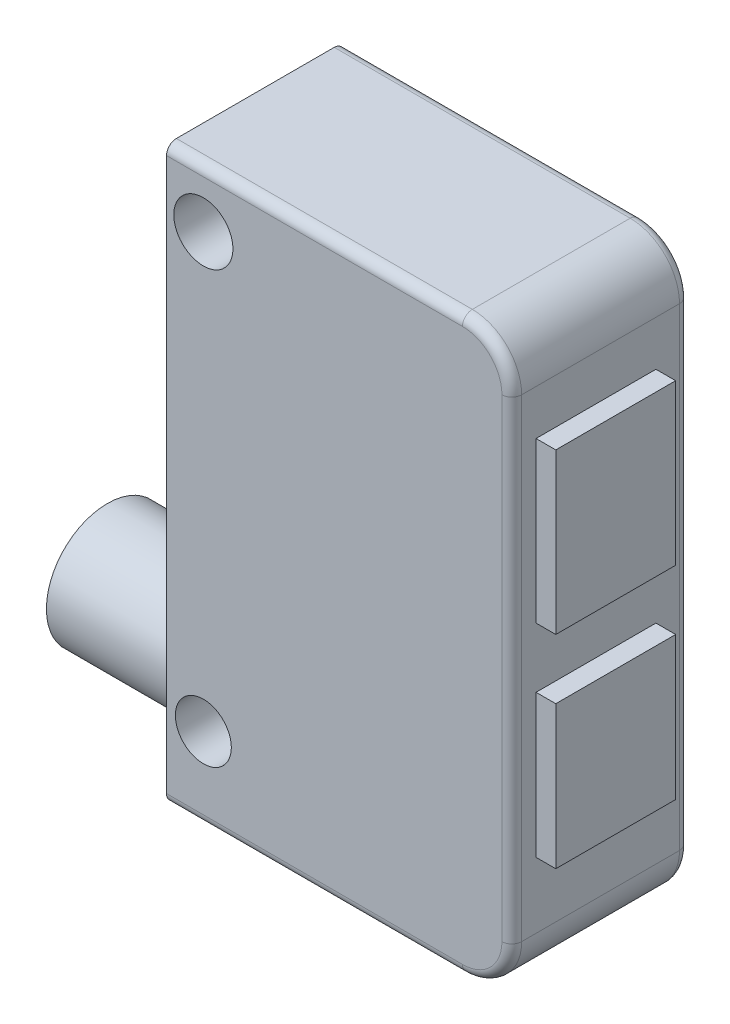
ISO-10303-21;
HEADER;
FILE_DESCRIPTION(('STEP AP214'),'2;1');
FILE_NAME('part.step','',(''),(''),'','','');
FILE_SCHEMA(('AUTOMOTIVE_DESIGN { 1 0 10303 214 1 1 1 1 }'));
ENDSEC;
DATA;
#1=APPLICATION_CONTEXT('core data for automotive mechanical design processes');
#2=APPLICATION_PROTOCOL_DEFINITION('international standard','automotive_design',2000,#1);
#3=PRODUCT_CONTEXT('',#1,'mechanical');
#4=PRODUCT('Part','Part','',(#3));
#5=PRODUCT_RELATED_PRODUCT_CATEGORY('part','',(#4));
#6=PRODUCT_DEFINITION_FORMATION('','',#4);
#7=PRODUCT_DEFINITION_CONTEXT('part definition',#1,'design');
#8=PRODUCT_DEFINITION('design','',#6,#7);
#9=PRODUCT_DEFINITION_SHAPE('','',#8);
#10=(LENGTH_UNIT() NAMED_UNIT(*) SI_UNIT(.MILLI.,.METRE.));
#11=(NAMED_UNIT(*) PLANE_ANGLE_UNIT() SI_UNIT($,.RADIAN.));
#12=(NAMED_UNIT(*) SI_UNIT($,.STERADIAN.) SOLID_ANGLE_UNIT());
#13=UNCERTAINTY_MEASURE_WITH_UNIT(LENGTH_MEASURE(1.E-05),#10,'distance_accuracy_value','');
#14=(GEOMETRIC_REPRESENTATION_CONTEXT(3) GLOBAL_UNCERTAINTY_ASSIGNED_CONTEXT((#13)) GLOBAL_UNIT_ASSIGNED_CONTEXT((#10,
#11,#12)) REPRESENTATION_CONTEXT('',''));
#15=CARTESIAN_POINT('',(0.,0.,0.));
#16=DIRECTION('',(0.,0.,1.));
#17=DIRECTION('',(1.,0.,0.));
#18=AXIS2_PLACEMENT_3D('',#15,#16,#17);
#19=CARTESIAN_POINT('',(17.5,29.,18.));
#20=DIRECTION('',(-1.,0.,0.));
#21=DIRECTION('',(0.,-1.,0.));
#22=AXIS2_PLACEMENT_3D('',#19,#20,#21);
#23=PLANE('',#22);
#24=DIRECTION('',(0.,1.,0.));
#25=VECTOR('',#24,1.);
#26=CARTESIAN_POINT('',(17.5,3.23268340968709,3.39148902415762));
#27=LINE('',#26,#25);
#28=CARTESIAN_POINT('',(17.5,3.23268340968709,3.39148902415762));
#29=VERTEX_POINT('',#28);
#30=CARTESIAN_POINT('',(17.5,19.4350484510095,3.39148902415762));
#31=VERTEX_POINT('',#30);
#32=EDGE_CURVE('E194',#29,#31,#27,.T.);
#33=ORIENTED_EDGE('',*,*,#32,.F.);
#34=DIRECTION('',(0.,0.,-1.));
#35=VECTOR('',#34,1.);
#36=CARTESIAN_POINT('',(17.5,3.23268340968709,15.5432628051494));
#37=LINE('',#36,#35);
#38=CARTESIAN_POINT('',(17.5,3.23268340968709,15.5432628051494));
#39=VERTEX_POINT('',#38);
#40=EDGE_CURVE('E207',#39,#29,#37,.T.);
#41=ORIENTED_EDGE('',*,*,#40,.F.);
#42=DIRECTION('',(0.,-1.,0.));
#43=VECTOR('',#42,1.);
#44=CARTESIAN_POINT('',(17.5,3.23268340968709,15.5432628051494));
#45=LINE('',#44,#43);
#46=CARTESIAN_POINT('',(17.5,19.4350484510095,15.5432628051494));
#47=VERTEX_POINT('',#46);
#48=EDGE_CURVE('E216',#47,#39,#45,.T.);
#49=ORIENTED_EDGE('',*,*,#48,.F.);
#50=DIRECTION('',(0.,0.,1.));
#51=VECTOR('',#50,1.);
#52=CARTESIAN_POINT('',(17.5,19.4350484510095,15.5432628051494));
#53=LINE('',#52,#51);
#54=EDGE_CURVE('E197',#31,#47,#53,.T.);
#55=ORIENTED_EDGE('',*,*,#54,.F.);
#56=EDGE_LOOP('',(#33,#41,#49,#55));
#57=FACE_BOUND('',#56,.T.);
#58=DIRECTION('',(0.,0.,-1.));
#59=VECTOR('',#58,1.);
#60=CARTESIAN_POINT('',(17.5,-24.,18.));
#61=LINE('',#60,#59);
#62=CARTESIAN_POINT('',(17.5,-24.,17.));
#63=VERTEX_POINT('',#62);
#64=CARTESIAN_POINT('',(17.5,-24.,1.));
#65=VERTEX_POINT('',#64);
#66=EDGE_CURVE('E267',#63,#65,#61,.T.);
#67=ORIENTED_EDGE('',*,*,#66,.T.);
#68=DIRECTION('',(0.,1.,0.));
#69=VECTOR('',#68,1.);
#70=CARTESIAN_POINT('',(17.5,29.,1.));
#71=LINE('',#70,#69);
#72=CARTESIAN_POINT('',(17.5,24.,1.));
#73=VERTEX_POINT('',#72);
#74=EDGE_CURVE('E305',#65,#73,#71,.T.);
#75=ORIENTED_EDGE('',*,*,#74,.T.);
#76=DIRECTION('',(0.,0.,-1.));
#77=VECTOR('',#76,1.);
#78=CARTESIAN_POINT('',(17.5,24.,18.));
#79=LINE('',#78,#77);
#80=CARTESIAN_POINT('',(17.5,24.,17.));
#81=VERTEX_POINT('',#80);
#82=EDGE_CURVE('E264',#73,#81,#79,.F.);
#83=ORIENTED_EDGE('',*,*,#82,.T.);
#84=DIRECTION('',(0.,1.,0.));
#85=VECTOR('',#84,1.);
#86=CARTESIAN_POINT('',(17.5,-24.,17.));
#87=LINE('',#86,#85);
#88=EDGE_CURVE('E303',#81,#63,#87,.F.);
#89=ORIENTED_EDGE('',*,*,#88,.T.);
#90=EDGE_LOOP('',(#67,#75,#83,#89));
#91=FACE_BOUND('',#90,.T.);
#92=DIRECTION('',(0.,1.,0.));
#93=VECTOR('',#92,1.);
#94=CARTESIAN_POINT('',(17.5,-17.3318568350683,3.39148902415762));
#95=LINE('',#94,#93);
#96=CARTESIAN_POINT('',(17.5,-17.3318568350683,3.39148902415762));
#97=VERTEX_POINT('',#96);
#98=CARTESIAN_POINT('',(17.5,-2.84320348080882,3.39148902415762));
#99=VERTEX_POINT('',#98);
#100=EDGE_CURVE('E193',#97,#99,#95,.T.);
#101=ORIENTED_EDGE('',*,*,#100,.F.);
#102=DIRECTION('',(0.,0.,-1.));
#103=VECTOR('',#102,1.);
#104=CARTESIAN_POINT('',(17.5,-17.3318568350683,15.5432628051494));
#105=LINE('',#104,#103);
#106=CARTESIAN_POINT('',(17.5,-17.3318568350683,15.5432628051494));
#107=VERTEX_POINT('',#106);
#108=EDGE_CURVE('E190',#107,#97,#105,.T.);
#109=ORIENTED_EDGE('',*,*,#108,.F.);
#110=DIRECTION('',(0.,-1.,0.));
#111=VECTOR('',#110,1.);
#112=CARTESIAN_POINT('',(17.5,-17.3318568350683,15.5432628051494));
#113=LINE('',#112,#111);
#114=CARTESIAN_POINT('',(17.5,-2.84320348080882,15.5432628051494));
#115=VERTEX_POINT('',#114);
#116=EDGE_CURVE('E57',#115,#107,#113,.T.);
#117=ORIENTED_EDGE('',*,*,#116,.F.);
#118=DIRECTION('',(0.,0.,1.));
#119=VECTOR('',#118,1.);
#120=CARTESIAN_POINT('',(17.5,-2.84320348080882,15.5432628051494));
#121=LINE('',#120,#119);
#122=EDGE_CURVE('E52',#99,#115,#121,.T.);
#123=ORIENTED_EDGE('',*,*,#122,.F.);
#124=EDGE_LOOP('',(#101,#109,#117,#123));
#125=FACE_BOUND('',#124,.T.);
#126=ADVANCED_FACE('F35',(#57,#91,#125),#23,.F.);
#127=CARTESIAN_POINT('',(-17.5,29.,18.));
#128=DIRECTION('',(0.,-1.,0.));
#129=DIRECTION('',(0.,0.,-1.));
#130=AXIS2_PLACEMENT_3D('',#127,#128,#129);
#131=PLANE('',#130);
#132=DIRECTION('',(0.,0.,-1.));
#133=VECTOR('',#132,1.);
#134=CARTESIAN_POINT('',(12.5,29.,18.));
#135=LINE('',#134,#133);
#136=CARTESIAN_POINT('',(12.5,29.,17.));
#137=VERTEX_POINT('',#136);
#138=CARTESIAN_POINT('',(12.5,29.,1.));
#139=VERTEX_POINT('',#138);
#140=EDGE_CURVE('E273',#137,#139,#135,.T.);
#141=ORIENTED_EDGE('',*,*,#140,.T.);
#142=DIRECTION('',(-1.,0.,0.));
#143=VECTOR('',#142,1.);
#144=CARTESIAN_POINT('',(-17.5,29.,1.));
#145=LINE('',#144,#143);
#146=CARTESIAN_POINT('',(-17.5,29.,1.));
#147=VERTEX_POINT('',#146);
#148=EDGE_CURVE('E11',#139,#147,#145,.T.);
#149=ORIENTED_EDGE('',*,*,#148,.T.);
#150=DIRECTION('',(0.,0.,-1.));
#151=VECTOR('',#150,1.);
#152=CARTESIAN_POINT('',(-17.5,29.,18.));
#153=LINE('',#152,#151);
#154=CARTESIAN_POINT('',(-17.5,29.,17.));
#155=VERTEX_POINT('',#154);
#156=EDGE_CURVE('E258',#155,#147,#153,.T.);
#157=ORIENTED_EDGE('',*,*,#156,.F.);
#158=DIRECTION('',(-1.,0.,0.));
#159=VECTOR('',#158,1.);
#160=CARTESIAN_POINT('',(12.5,29.,17.));
#161=LINE('',#160,#159);
#162=EDGE_CURVE('E44',#155,#137,#161,.F.);
#163=ORIENTED_EDGE('',*,*,#162,.T.);
#164=EDGE_LOOP('',(#141,#149,#157,#163));
#165=FACE_BOUND('',#164,.T.);
#166=ADVANCED_FACE('F405',(#165),#131,.F.);
#167=CARTESIAN_POINT('',(-17.5,29.,18.));
#168=DIRECTION('',(1.,0.,0.));
#169=DIRECTION('',(0.,1.,0.));
#170=AXIS2_PLACEMENT_3D('',#167,#168,#169);
#171=PLANE('',#170);
#172=CARTESIAN_POINT('',(-17.5,-21.7144106468702,8.));
#173=DIRECTION('',(1.,0.,0.));
#174=DIRECTION('',(0.,1.,0.));
#175=AXIS2_PLACEMENT_3D('',#172,#173,#174);
#176=CIRCLE('',#175,6.1718519708485);
#177=CARTESIAN_POINT('',(-17.5,-15.5425586760217,8.));
#178=VERTEX_POINT('',#177);
#179=EDGE_CURVE('E261',#178,#178,#176,.F.);
#180=ORIENTED_EDGE('',*,*,#179,.F.);
#181=EDGE_LOOP('',(#180));
#182=FACE_BOUND('',#181,.T.);
#183=DIRECTION('',(0.,-1.,0.));
#184=VECTOR('',#183,1.);
#185=CARTESIAN_POINT('',(-17.5,29.,0.));
#186=LINE('',#185,#184);
#187=CARTESIAN_POINT('',(-17.5,28.,0.));
#188=VERTEX_POINT('',#187);
#189=CARTESIAN_POINT('',(-17.5,-28.,0.));
#190=VERTEX_POINT('',#189);
#191=EDGE_CURVE('E248',#188,#190,#186,.T.);
#192=ORIENTED_EDGE('',*,*,#191,.T.);
#193=CARTESIAN_POINT('',(-17.5,-28.,1.));
#194=DIRECTION('',(1.,0.,0.));
#195=DIRECTION('',(0.,1.,0.));
#196=AXIS2_PLACEMENT_3D('',#193,#194,#195);
#197=CIRCLE('',#196,1.);
#198=CARTESIAN_POINT('',(-17.5,-29.,1.));
#199=VERTEX_POINT('',#198);
#200=EDGE_CURVE('E297',#190,#199,#197,.F.);
#201=ORIENTED_EDGE('',*,*,#200,.T.);
#202=DIRECTION('',(0.,0.,-1.));
#203=VECTOR('',#202,1.);
#204=CARTESIAN_POINT('',(-17.5,-29.,18.));
#205=LINE('',#204,#203);
#206=CARTESIAN_POINT('',(-17.5,-29.,17.));
#207=VERTEX_POINT('',#206);
#208=EDGE_CURVE('E253',#207,#199,#205,.T.);
#209=ORIENTED_EDGE('',*,*,#208,.F.);
#210=CARTESIAN_POINT('',(-17.5,-28.,17.));
#211=DIRECTION('',(1.,0.,0.));
#212=DIRECTION('',(0.,1.,0.));
#213=AXIS2_PLACEMENT_3D('',#210,#211,#212);
#214=CIRCLE('',#213,1.);
#215=CARTESIAN_POINT('',(-17.5,-28.,18.));
#216=VERTEX_POINT('',#215);
#217=EDGE_CURVE('E295',#207,#216,#214,.F.);
#218=ORIENTED_EDGE('',*,*,#217,.T.);
#219=DIRECTION('',(0.,-1.,0.));
#220=VECTOR('',#219,1.);
#221=CARTESIAN_POINT('',(-17.5,29.,18.));
#222=LINE('',#221,#220);
#223=CARTESIAN_POINT('',(-17.5,28.,18.));
#224=VERTEX_POINT('',#223);
#225=EDGE_CURVE('E250',#224,#216,#222,.T.);
#226=ORIENTED_EDGE('',*,*,#225,.F.);
#227=CARTESIAN_POINT('',(-17.5,28.,17.));
#228=DIRECTION('',(1.,0.,0.));
#229=DIRECTION('',(0.,1.,0.));
#230=AXIS2_PLACEMENT_3D('',#227,#228,#229);
#231=CIRCLE('',#230,1.);
#232=EDGE_CURVE('E291',#224,#155,#231,.F.);
#233=ORIENTED_EDGE('',*,*,#232,.T.);
#234=ORIENTED_EDGE('',*,*,#156,.T.);
#235=CARTESIAN_POINT('',(-17.5,28.,1.));
#236=DIRECTION('',(1.,0.,0.));
#237=DIRECTION('',(0.,1.,0.));
#238=AXIS2_PLACEMENT_3D('',#235,#236,#237);
#239=CIRCLE('',#238,1.);
#240=EDGE_CURVE('E293',#147,#188,#239,.F.);
#241=ORIENTED_EDGE('',*,*,#240,.T.);
#242=EDGE_LOOP('',(#192,#201,#209,#218,#226,#233,#234,#241));
#243=FACE_BOUND('',#242,.T.);
#244=ADVANCED_FACE('F357',(#182,#243),#171,.F.);
#245=CARTESIAN_POINT('',(-17.5,-29.,18.));
#246=DIRECTION('',(0.,1.,0.));
#247=DIRECTION('',(0.,0.,1.));
#248=AXIS2_PLACEMENT_3D('',#245,#246,#247);
#249=PLANE('',#248);
#250=ORIENTED_EDGE('',*,*,#208,.T.);
#251=DIRECTION('',(1.,0.,0.));
#252=VECTOR('',#251,1.);
#253=CARTESIAN_POINT('',(-17.5,-29.,1.));
#254=LINE('',#253,#252);
#255=CARTESIAN_POINT('',(12.5,-29.,1.));
#256=VERTEX_POINT('',#255);
#257=EDGE_CURVE('E278',#199,#256,#254,.T.);
#258=ORIENTED_EDGE('',*,*,#257,.T.);
#259=DIRECTION('',(0.,0.,-1.));
#260=VECTOR('',#259,1.);
#261=CARTESIAN_POINT('',(12.5,-29.,18.));
#262=LINE('',#261,#260);
#263=CARTESIAN_POINT('',(12.5,-29.,17.));
#264=VERTEX_POINT('',#263);
#265=EDGE_CURVE('E270',#256,#264,#262,.F.);
#266=ORIENTED_EDGE('',*,*,#265,.T.);
#267=DIRECTION('',(1.,0.,0.));
#268=VECTOR('',#267,1.);
#269=CARTESIAN_POINT('',(-17.5,-29.,17.));
#270=LINE('',#269,#268);
#271=EDGE_CURVE('E276',#264,#207,#270,.F.);
#272=ORIENTED_EDGE('',*,*,#271,.T.);
#273=EDGE_LOOP('',(#250,#258,#266,#272));
#274=FACE_BOUND('',#273,.T.);
#275=ADVANCED_FACE('F376',(#274),#249,.F.);
#276=CARTESIAN_POINT('',(0.,0.,18.));
#277=DIRECTION('',(0.,0.,1.));
#278=DIRECTION('',(1.,0.,0.));
#279=AXIS2_PLACEMENT_3D('',#276,#277,#278);
#280=PLANE('',#279);
#281=CARTESIAN_POINT('',(-13.7643029473936,-20.6813842234187,18.));
#282=DIRECTION('',(0.,0.,1.));
#283=DIRECTION('',(1.,0.,0.));
#284=AXIS2_PLACEMENT_3D('',#281,#282,#283);
#285=CIRCLE('',#284,2.83545668190059);
#286=CARTESIAN_POINT('',(-10.928846265493,-20.6813842234187,18.));
#287=VERTEX_POINT('',#286);
#288=EDGE_CURVE('E232',#287,#287,#285,.T.);
#289=ORIENTED_EDGE('',*,*,#288,.F.);
#290=EDGE_LOOP('',(#289));
#291=FACE_BOUND('',#290,.T.);
#292=CARTESIAN_POINT('',(-13.7643029473936,23.1740557682377,18.));
#293=DIRECTION('',(0.,0.,1.));
#294=DIRECTION('',(1.,0.,0.));
#295=AXIS2_PLACEMENT_3D('',#292,#293,#294);
#296=CIRCLE('',#295,2.99773064042235);
#297=CARTESIAN_POINT('',(-10.7665723069712,23.1740557682377,18.));
#298=VERTEX_POINT('',#297);
#299=EDGE_CURVE('E236',#298,#298,#296,.T.);
#300=ORIENTED_EDGE('',*,*,#299,.F.);
#301=EDGE_LOOP('',(#300));
#302=FACE_BOUND('',#301,.T.);
#303=ORIENTED_EDGE('',*,*,#225,.T.);
#304=DIRECTION('',(1.,0.,0.));
#305=VECTOR('',#304,1.);
#306=CARTESIAN_POINT('',(12.5,-28.,18.));
#307=LINE('',#306,#305);
#308=CARTESIAN_POINT('',(12.5,-28.,18.));
#309=VERTEX_POINT('',#308);
#310=EDGE_CURVE('E319',#216,#309,#307,.T.);
#311=ORIENTED_EDGE('',*,*,#310,.T.);
#312=CARTESIAN_POINT('',(12.5,-24.,18.));
#313=DIRECTION('',(0.,0.,1.));
#314=DIRECTION('',(1.,0.,0.));
#315=AXIS2_PLACEMENT_3D('',#312,#313,#314);
#316=CIRCLE('',#315,4.);
#317=CARTESIAN_POINT('',(16.5,-24.,18.));
#318=VERTEX_POINT('',#317);
#319=EDGE_CURVE('E317',#309,#318,#316,.T.);
#320=ORIENTED_EDGE('',*,*,#319,.T.);
#321=DIRECTION('',(0.,1.,0.));
#322=VECTOR('',#321,1.);
#323=CARTESIAN_POINT('',(16.5,24.,18.));
#324=LINE('',#323,#322);
#325=CARTESIAN_POINT('',(16.5,24.,18.));
#326=VERTEX_POINT('',#325);
#327=EDGE_CURVE('E315',#318,#326,#324,.T.);
#328=ORIENTED_EDGE('',*,*,#327,.T.);
#329=CARTESIAN_POINT('',(12.5,24.,18.));
#330=DIRECTION('',(0.,0.,1.));
#331=DIRECTION('',(1.,0.,0.));
#332=AXIS2_PLACEMENT_3D('',#329,#330,#331);
#333=CIRCLE('',#332,4.);
#334=CARTESIAN_POINT('',(12.5,28.,18.));
#335=VERTEX_POINT('',#334);
#336=EDGE_CURVE('E313',#326,#335,#333,.T.);
#337=ORIENTED_EDGE('',*,*,#336,.T.);
#338=DIRECTION('',(-1.,0.,0.));
#339=VECTOR('',#338,1.);
#340=CARTESIAN_POINT('',(-17.5,28.,18.));
#341=LINE('',#340,#339);
#342=EDGE_CURVE('E311',#335,#224,#341,.T.);
#343=ORIENTED_EDGE('',*,*,#342,.T.);
#344=EDGE_LOOP('',(#303,#311,#320,#328,#337,#343));
#345=FACE_BOUND('',#344,.T.);
#346=ADVANCED_FACE('F354',(#291,#302,#345),#280,.T.);
#347=CARTESIAN_POINT('',(0.,0.,0.));
#348=DIRECTION('',(0.,0.,1.));
#349=DIRECTION('',(1.,0.,0.));
#350=AXIS2_PLACEMENT_3D('',#347,#348,#349);
#351=PLANE('',#350);
#352=CARTESIAN_POINT('',(12.5,-24.,0.));
#353=DIRECTION('',(0.,0.,1.));
#354=DIRECTION('',(1.,0.,0.));
#355=AXIS2_PLACEMENT_3D('',#352,#353,#354);
#356=CIRCLE('',#355,4.);
#357=CARTESIAN_POINT('',(16.5,-24.,0.));
#358=VERTEX_POINT('',#357);
#359=CARTESIAN_POINT('',(12.5,-28.,0.));
#360=VERTEX_POINT('',#359);
#361=EDGE_CURVE('E287',#358,#360,#356,.F.);
#362=ORIENTED_EDGE('',*,*,#361,.T.);
#363=DIRECTION('',(1.,0.,0.));
#364=VECTOR('',#363,1.);
#365=CARTESIAN_POINT('',(0.,-28.,0.));
#366=LINE('',#365,#364);
#367=EDGE_CURVE('E289',#360,#190,#366,.F.);
#368=ORIENTED_EDGE('',*,*,#367,.T.);
#369=ORIENTED_EDGE('',*,*,#191,.F.);
#370=DIRECTION('',(-1.,0.,0.));
#371=VECTOR('',#370,1.);
#372=CARTESIAN_POINT('',(0.,28.,0.));
#373=LINE('',#372,#371);
#374=CARTESIAN_POINT('',(12.5,28.,0.));
#375=VERTEX_POINT('',#374);
#376=EDGE_CURVE('E281',#188,#375,#373,.F.);
#377=ORIENTED_EDGE('',*,*,#376,.T.);
#378=CARTESIAN_POINT('',(12.5,24.,0.));
#379=DIRECTION('',(0.,0.,1.));
#380=DIRECTION('',(1.,0.,0.));
#381=AXIS2_PLACEMENT_3D('',#378,#379,#380);
#382=CIRCLE('',#381,4.);
#383=CARTESIAN_POINT('',(16.5,24.,0.));
#384=VERTEX_POINT('',#383);
#385=EDGE_CURVE('E283',#375,#384,#382,.F.);
#386=ORIENTED_EDGE('',*,*,#385,.T.);
#387=DIRECTION('',(0.,1.,0.));
#388=VECTOR('',#387,1.);
#389=CARTESIAN_POINT('',(16.5,0.,0.));
#390=LINE('',#389,#388);
#391=EDGE_CURVE('E285',#384,#358,#390,.F.);
#392=ORIENTED_EDGE('',*,*,#391,.T.);
#393=EDGE_LOOP('',(#362,#368,#369,#377,#386,#392));
#394=FACE_BOUND('',#393,.T.);
#395=ADVANCED_FACE('F412',(#394),#351,.F.);
#396=CARTESIAN_POINT('',(-33.5,-21.7144106468702,8.));
#397=DIRECTION('',(1.,0.,0.));
#398=DIRECTION('',(0.,1.,0.));
#399=AXIS2_PLACEMENT_3D('',#396,#397,#398);
#400=CYLINDRICAL_SURFACE('',#399,6.1718519708485);
#401=CARTESIAN_POINT('',(-33.5,-21.7144106468702,8.));
#402=DIRECTION('',(-1.,0.,0.));
#403=DIRECTION('',(0.,-1.,0.));
#404=AXIS2_PLACEMENT_3D('',#401,#402,#403);
#405=CIRCLE('',#404,6.1718519708485);
#406=CARTESIAN_POINT('',(-33.5,-27.8862626177187,8.));
#407=VERTEX_POINT('',#406);
#408=EDGE_CURVE('E245',#407,#407,#405,.T.);
#409=ORIENTED_EDGE('',*,*,#408,.F.);
#410=EDGE_LOOP('',(#409));
#411=FACE_BOUND('',#410,.T.);
#412=ORIENTED_EDGE('',*,*,#179,.T.);
#413=EDGE_LOOP('',(#412));
#414=FACE_BOUND('',#413,.T.);
#415=ADVANCED_FACE('F414',(#411,#414),#400,.T.);
#416=CARTESIAN_POINT('',(-33.5,-21.7144106468702,8.));
#417=DIRECTION('',(-1.,0.,0.));
#418=DIRECTION('',(0.,-1.,0.));
#419=AXIS2_PLACEMENT_3D('',#416,#417,#418);
#420=PLANE('',#419);
#421=ORIENTED_EDGE('',*,*,#408,.T.);
#422=EDGE_LOOP('',(#421));
#423=FACE_BOUND('',#422,.T.);
#424=ADVANCED_FACE('F420',(#423),#420,.T.);
#425=CARTESIAN_POINT('',(12.5,-24.,18.));
#426=DIRECTION('',(0.,0.,-1.));
#427=DIRECTION('',(-1.,0.,0.));
#428=AXIS2_PLACEMENT_3D('',#425,#426,#427);
#429=CYLINDRICAL_SURFACE('',#428,5.);
#430=ORIENTED_EDGE('',*,*,#265,.F.);
#431=CARTESIAN_POINT('',(12.5,-24.,1.));
#432=DIRECTION('',(0.,0.,1.));
#433=DIRECTION('',(1.,0.,0.));
#434=AXIS2_PLACEMENT_3D('',#431,#432,#433);
#435=CIRCLE('',#434,5.);
#436=EDGE_CURVE('E301',#256,#65,#435,.T.);
#437=ORIENTED_EDGE('',*,*,#436,.T.);
#438=ORIENTED_EDGE('',*,*,#66,.F.);
#439=CARTESIAN_POINT('',(12.5,-24.,17.));
#440=DIRECTION('',(0.,0.,1.));
#441=DIRECTION('',(1.,0.,0.));
#442=AXIS2_PLACEMENT_3D('',#439,#440,#441);
#443=CIRCLE('',#442,5.);
#444=EDGE_CURVE('E299',#63,#264,#443,.F.);
#445=ORIENTED_EDGE('',*,*,#444,.T.);
#446=EDGE_LOOP('',(#430,#437,#438,#445));
#447=FACE_BOUND('',#446,.T.);
#448=ADVANCED_FACE('F374',(#447),#429,.T.);
#449=CARTESIAN_POINT('',(12.5,24.,18.));
#450=DIRECTION('',(0.,0.,-1.));
#451=DIRECTION('',(-1.,0.,0.));
#452=AXIS2_PLACEMENT_3D('',#449,#450,#451);
#453=CYLINDRICAL_SURFACE('',#452,5.);
#454=ORIENTED_EDGE('',*,*,#82,.F.);
#455=CARTESIAN_POINT('',(12.5,24.,1.));
#456=DIRECTION('',(0.,0.,1.));
#457=DIRECTION('',(1.,0.,0.));
#458=AXIS2_PLACEMENT_3D('',#455,#456,#457);
#459=CIRCLE('',#458,5.);
#460=EDGE_CURVE('E309',#73,#139,#459,.T.);
#461=ORIENTED_EDGE('',*,*,#460,.T.);
#462=ORIENTED_EDGE('',*,*,#140,.F.);
#463=CARTESIAN_POINT('',(12.5,24.,17.));
#464=DIRECTION('',(0.,0.,1.));
#465=DIRECTION('',(1.,0.,0.));
#466=AXIS2_PLACEMENT_3D('',#463,#464,#465);
#467=CIRCLE('',#466,5.);
#468=EDGE_CURVE('E307',#137,#81,#467,.F.);
#469=ORIENTED_EDGE('',*,*,#468,.T.);
#470=EDGE_LOOP('',(#454,#461,#462,#469));
#471=FACE_BOUND('',#470,.T.);
#472=ADVANCED_FACE('F402',(#471),#453,.T.);
#473=CARTESIAN_POINT('',(-17.5,28.,1.));
#474=DIRECTION('',(-1.,0.,0.));
#475=DIRECTION('',(0.,0.,1.));
#476=AXIS2_PLACEMENT_3D('',#473,#474,#475);
#477=CYLINDRICAL_SURFACE('',#476,1.);
#478=ORIENTED_EDGE('',*,*,#240,.F.);
#479=ORIENTED_EDGE('',*,*,#148,.F.);
#480=CARTESIAN_POINT('',(12.5,28.,1.));
#481=DIRECTION('',(1.,0.,0.));
#482=DIRECTION('',(0.,0.,-1.));
#483=AXIS2_PLACEMENT_3D('',#480,#481,#482);
#484=CIRCLE('',#483,1.);
#485=EDGE_CURVE('E249',#375,#139,#484,.T.);
#486=ORIENTED_EDGE('',*,*,#485,.F.);
#487=ORIENTED_EDGE('',*,*,#376,.F.);
#488=EDGE_LOOP('',(#478,#479,#486,#487));
#489=FACE_BOUND('',#488,.T.);
#490=ADVANCED_FACE('F408',(#489),#477,.T.);
#491=CARTESIAN_POINT('',(12.5,24.,1.));
#492=DIRECTION('',(0.,0.,1.));
#493=DIRECTION('',(1.,0.,0.));
#494=AXIS2_PLACEMENT_3D('',#491,#492,#493);
#495=TOROIDAL_SURFACE('',#494,4.,1.);
#496=ORIENTED_EDGE('',*,*,#485,.T.);
#497=ORIENTED_EDGE('',*,*,#460,.F.);
#498=CARTESIAN_POINT('',(16.5,24.,1.));
#499=DIRECTION('',(0.,-1.,0.));
#500=DIRECTION('',(0.,0.,-1.));
#501=AXIS2_PLACEMENT_3D('',#498,#499,#500);
#502=CIRCLE('',#501,1.);
#503=EDGE_CURVE('E328',#384,#73,#502,.T.);
#504=ORIENTED_EDGE('',*,*,#503,.F.);
#505=ORIENTED_EDGE('',*,*,#385,.F.);
#506=EDGE_LOOP('',(#496,#497,#504,#505));
#507=FACE_BOUND('',#506,.T.);
#508=ADVANCED_FACE('F398',(#507),#495,.T.);
#509=CARTESIAN_POINT('',(16.5,29.,1.));
#510=DIRECTION('',(0.,1.,0.));
#511=DIRECTION('',(-1.,0.,0.));
#512=AXIS2_PLACEMENT_3D('',#509,#510,#511);
#513=CYLINDRICAL_SURFACE('',#512,1.);
#514=ORIENTED_EDGE('',*,*,#503,.T.);
#515=ORIENTED_EDGE('',*,*,#74,.F.);
#516=CARTESIAN_POINT('',(16.5,-24.,1.));
#517=DIRECTION('',(0.,-1.,0.));
#518=DIRECTION('',(0.,0.,-1.));
#519=AXIS2_PLACEMENT_3D('',#516,#517,#518);
#520=CIRCLE('',#519,1.);
#521=EDGE_CURVE('E325',#358,#65,#520,.T.);
#522=ORIENTED_EDGE('',*,*,#521,.F.);
#523=ORIENTED_EDGE('',*,*,#391,.F.);
#524=EDGE_LOOP('',(#514,#515,#522,#523));
#525=FACE_BOUND('',#524,.T.);
#526=ADVANCED_FACE('F392',(#525),#513,.T.);
#527=CARTESIAN_POINT('',(12.5,-24.,1.));
#528=DIRECTION('',(0.,0.,1.));
#529=DIRECTION('',(1.,0.,0.));
#530=AXIS2_PLACEMENT_3D('',#527,#528,#529);
#531=TOROIDAL_SURFACE('',#530,4.,1.);
#532=ORIENTED_EDGE('',*,*,#521,.T.);
#533=ORIENTED_EDGE('',*,*,#436,.F.);
#534=CARTESIAN_POINT('',(12.5,-28.,1.));
#535=DIRECTION('',(-1.,0.,0.));
#536=DIRECTION('',(0.,0.,1.));
#537=AXIS2_PLACEMENT_3D('',#534,#535,#536);
#538=CIRCLE('',#537,1.);
#539=EDGE_CURVE('E323',#360,#256,#538,.T.);
#540=ORIENTED_EDGE('',*,*,#539,.F.);
#541=ORIENTED_EDGE('',*,*,#361,.F.);
#542=EDGE_LOOP('',(#532,#533,#540,#541));
#543=FACE_BOUND('',#542,.T.);
#544=ADVANCED_FACE('F386',(#543),#531,.T.);
#545=CARTESIAN_POINT('',(-17.5,-28.,1.));
#546=DIRECTION('',(1.,0.,0.));
#547=DIRECTION('',(0.,0.,-1.));
#548=AXIS2_PLACEMENT_3D('',#545,#546,#547);
#549=CYLINDRICAL_SURFACE('',#548,1.);
#550=ORIENTED_EDGE('',*,*,#200,.F.);
#551=ORIENTED_EDGE('',*,*,#367,.F.);
#552=ORIENTED_EDGE('',*,*,#539,.T.);
#553=ORIENTED_EDGE('',*,*,#257,.F.);
#554=EDGE_LOOP('',(#550,#551,#552,#553));
#555=FACE_BOUND('',#554,.T.);
#556=ADVANCED_FACE('F380',(#555),#549,.T.);
#557=CARTESIAN_POINT('',(0.,28.,17.));
#558=DIRECTION('',(1.,0.,0.));
#559=DIRECTION('',(0.,0.,-1.));
#560=AXIS2_PLACEMENT_3D('',#557,#558,#559);
#561=CYLINDRICAL_SURFACE('',#560,1.);
#562=ORIENTED_EDGE('',*,*,#232,.F.);
#563=ORIENTED_EDGE('',*,*,#342,.F.);
#564=CARTESIAN_POINT('',(12.5,28.,17.));
#565=DIRECTION('',(1.,0.,0.));
#566=DIRECTION('',(0.,0.,-1.));
#567=AXIS2_PLACEMENT_3D('',#564,#565,#566);
#568=CIRCLE('',#567,1.);
#569=EDGE_CURVE('E39',#137,#335,#568,.T.);
#570=ORIENTED_EDGE('',*,*,#569,.F.);
#571=ORIENTED_EDGE('',*,*,#162,.F.);
#572=EDGE_LOOP('',(#562,#563,#570,#571));
#573=FACE_BOUND('',#572,.T.);
#574=ADVANCED_FACE('F37',(#573),#561,.T.);
#575=CARTESIAN_POINT('',(12.5,24.,17.));
#576=DIRECTION('',(0.,0.,1.));
#577=DIRECTION('',(1.,0.,0.));
#578=AXIS2_PLACEMENT_3D('',#575,#576,#577);
#579=TOROIDAL_SURFACE('',#578,4.,1.);
#580=ORIENTED_EDGE('',*,*,#569,.T.);
#581=ORIENTED_EDGE('',*,*,#336,.F.);
#582=CARTESIAN_POINT('',(16.5,24.,17.));
#583=DIRECTION('',(0.,-1.,0.));
#584=DIRECTION('',(0.,0.,-1.));
#585=AXIS2_PLACEMENT_3D('',#582,#583,#584);
#586=CIRCLE('',#585,1.);
#587=EDGE_CURVE('E336',#81,#326,#586,.T.);
#588=ORIENTED_EDGE('',*,*,#587,.F.);
#589=ORIENTED_EDGE('',*,*,#468,.F.);
#590=EDGE_LOOP('',(#580,#581,#588,#589));
#591=FACE_BOUND('',#590,.T.);
#592=ADVANCED_FACE('F347',(#591),#579,.T.);
#593=CARTESIAN_POINT('',(16.5,0.,17.));
#594=DIRECTION('',(0.,-1.,0.));
#595=DIRECTION('',(1.,0.,0.));
#596=AXIS2_PLACEMENT_3D('',#593,#594,#595);
#597=CYLINDRICAL_SURFACE('',#596,1.);
#598=ORIENTED_EDGE('',*,*,#587,.T.);
#599=ORIENTED_EDGE('',*,*,#327,.F.);
#600=CARTESIAN_POINT('',(16.5,-24.,17.));
#601=DIRECTION('',(0.,-1.,0.));
#602=DIRECTION('',(0.,0.,-1.));
#603=AXIS2_PLACEMENT_3D('',#600,#601,#602);
#604=CIRCLE('',#603,1.);
#605=EDGE_CURVE('E334',#63,#318,#604,.T.);
#606=ORIENTED_EDGE('',*,*,#605,.F.);
#607=ORIENTED_EDGE('',*,*,#88,.F.);
#608=EDGE_LOOP('',(#598,#599,#606,#607));
#609=FACE_BOUND('',#608,.T.);
#610=ADVANCED_FACE('F368',(#609),#597,.T.);
#611=CARTESIAN_POINT('',(12.5,-24.,17.));
#612=DIRECTION('',(0.,0.,1.));
#613=DIRECTION('',(1.,0.,0.));
#614=AXIS2_PLACEMENT_3D('',#611,#612,#613);
#615=TOROIDAL_SURFACE('',#614,4.,1.);
#616=ORIENTED_EDGE('',*,*,#605,.T.);
#617=ORIENTED_EDGE('',*,*,#319,.F.);
#618=CARTESIAN_POINT('',(12.5,-28.,17.));
#619=DIRECTION('',(-1.,0.,0.));
#620=DIRECTION('',(0.,0.,1.));
#621=AXIS2_PLACEMENT_3D('',#618,#619,#620);
#622=CIRCLE('',#621,1.);
#623=EDGE_CURVE('E242',#264,#309,#622,.T.);
#624=ORIENTED_EDGE('',*,*,#623,.F.);
#625=ORIENTED_EDGE('',*,*,#444,.F.);
#626=EDGE_LOOP('',(#616,#617,#624,#625));
#627=FACE_BOUND('',#626,.T.);
#628=ADVANCED_FACE('F370',(#627),#615,.T.);
#629=CARTESIAN_POINT('',(0.,-28.,17.));
#630=DIRECTION('',(-1.,0.,0.));
#631=DIRECTION('',(0.,0.,1.));
#632=AXIS2_PLACEMENT_3D('',#629,#630,#631);
#633=CYLINDRICAL_SURFACE('',#632,1.);
#634=ORIENTED_EDGE('',*,*,#217,.F.);
#635=ORIENTED_EDGE('',*,*,#271,.F.);
#636=ORIENTED_EDGE('',*,*,#623,.T.);
#637=ORIENTED_EDGE('',*,*,#310,.F.);
#638=EDGE_LOOP('',(#634,#635,#636,#637));
#639=FACE_BOUND('',#638,.T.);
#640=ADVANCED_FACE('F363',(#639),#633,.T.);
#641=CARTESIAN_POINT('',(-13.7643029473936,23.1740557682377,2.));
#642=DIRECTION('',(0.,0.,1.));
#643=DIRECTION('',(1.,0.,0.));
#644=AXIS2_PLACEMENT_3D('',#641,#642,#643);
#645=CYLINDRICAL_SURFACE('',#644,2.99773064042235);
#646=CARTESIAN_POINT('',(-13.7643029473936,23.1740557682377,2.));
#647=DIRECTION('',(0.,0.,1.));
#648=DIRECTION('',(1.,0.,0.));
#649=AXIS2_PLACEMENT_3D('',#646,#647,#648);
#650=CIRCLE('',#649,2.99773064042235);
#651=CARTESIAN_POINT('',(-10.7665723069712,23.1740557682377,2.));
#652=VERTEX_POINT('',#651);
#653=EDGE_CURVE('E239',#652,#652,#650,.T.);
#654=ORIENTED_EDGE('',*,*,#653,.F.);
#655=EDGE_LOOP('',(#654));
#656=FACE_BOUND('',#655,.T.);
#657=ORIENTED_EDGE('',*,*,#299,.T.);
#658=EDGE_LOOP('',(#657));
#659=FACE_BOUND('',#658,.T.);
#660=ADVANCED_FACE('F451',(#656,#659),#645,.F.);
#661=CARTESIAN_POINT('',(-13.7643029473936,23.1740557682377,2.));
#662=DIRECTION('',(0.,0.,1.));
#663=DIRECTION('',(1.,0.,0.));
#664=AXIS2_PLACEMENT_3D('',#661,#662,#663);
#665=PLANE('',#664);
#666=ORIENTED_EDGE('',*,*,#653,.T.);
#667=EDGE_LOOP('',(#666));
#668=FACE_BOUND('',#667,.T.);
#669=ADVANCED_FACE('F613',(#668),#665,.T.);
#670=CARTESIAN_POINT('',(-13.7643029473936,-20.6813842234187,2.));
#671=DIRECTION('',(0.,0.,1.));
#672=DIRECTION('',(1.,0.,0.));
#673=AXIS2_PLACEMENT_3D('',#670,#671,#672);
#674=CYLINDRICAL_SURFACE('',#673,2.83545668190059);
#675=CARTESIAN_POINT('',(-13.7643029473936,-20.6813842234187,2.));
#676=DIRECTION('',(0.,0.,1.));
#677=DIRECTION('',(1.,0.,0.));
#678=AXIS2_PLACEMENT_3D('',#675,#676,#677);
#679=CIRCLE('',#678,2.83545668190059);
#680=CARTESIAN_POINT('',(-10.928846265493,-20.6813842234187,2.));
#681=VERTEX_POINT('',#680);
#682=EDGE_CURVE('E233',#681,#681,#679,.T.);
#683=ORIENTED_EDGE('',*,*,#682,.F.);
#684=EDGE_LOOP('',(#683));
#685=FACE_BOUND('',#684,.T.);
#686=ORIENTED_EDGE('',*,*,#288,.T.);
#687=EDGE_LOOP('',(#686));
#688=FACE_BOUND('',#687,.T.);
#689=ADVANCED_FACE('F609',(#685,#688),#674,.F.);
#690=CARTESIAN_POINT('',(-13.7643029473936,-20.6813842234187,2.));
#691=DIRECTION('',(0.,0.,1.));
#692=DIRECTION('',(1.,0.,0.));
#693=AXIS2_PLACEMENT_3D('',#690,#691,#692);
#694=PLANE('',#693);
#695=ORIENTED_EDGE('',*,*,#682,.T.);
#696=EDGE_LOOP('',(#695));
#697=FACE_BOUND('',#696,.T.);
#698=ADVANCED_FACE('F605',(#697),#694,.T.);
#699=CARTESIAN_POINT('',(19.5,3.23268340968709,3.39148902415762));
#700=DIRECTION('',(0.,0.,1.));
#701=DIRECTION('',(1.,0.,0.));
#702=AXIS2_PLACEMENT_3D('',#699,#700,#701);
#703=PLANE('',#702);
#704=ORIENTED_EDGE('',*,*,#32,.T.);
#705=DIRECTION('',(-1.,0.,0.));
#706=VECTOR('',#705,1.);
#707=CARTESIAN_POINT('',(19.5,19.4350484510095,3.39148902415762));
#708=LINE('',#707,#706);
#709=CARTESIAN_POINT('',(19.5,19.4350484510095,3.39148902415762));
#710=VERTEX_POINT('',#709);
#711=EDGE_CURVE('E229',#710,#31,#708,.T.);
#712=ORIENTED_EDGE('',*,*,#711,.F.);
#713=DIRECTION('',(0.,1.,0.));
#714=VECTOR('',#713,1.);
#715=CARTESIAN_POINT('',(19.5,3.23268340968709,3.39148902415762));
#716=LINE('',#715,#714);
#717=CARTESIAN_POINT('',(19.5,3.23268340968709,3.39148902415762));
#718=VERTEX_POINT('',#717);
#719=EDGE_CURVE('E203',#718,#710,#716,.T.);
#720=ORIENTED_EDGE('',*,*,#719,.F.);
#721=DIRECTION('',(-1.,0.,0.));
#722=VECTOR('',#721,1.);
#723=CARTESIAN_POINT('',(19.5,3.23268340968709,3.39148902415762));
#724=LINE('',#723,#722);
#725=EDGE_CURVE('E212',#718,#29,#724,.T.);
#726=ORIENTED_EDGE('',*,*,#725,.T.);
#727=EDGE_LOOP('',(#704,#712,#720,#726));
#728=FACE_BOUND('',#727,.T.);
#729=ADVANCED_FACE('F530',(#728),#703,.F.);
#730=CARTESIAN_POINT('',(19.5,19.4350484510095,15.5432628051494));
#731=DIRECTION('',(0.,-1.,0.));
#732=DIRECTION('',(1.,0.,0.));
#733=AXIS2_PLACEMENT_3D('',#730,#731,#732);
#734=PLANE('',#733);
#735=ORIENTED_EDGE('',*,*,#54,.T.);
#736=DIRECTION('',(-1.,0.,0.));
#737=VECTOR('',#736,1.);
#738=CARTESIAN_POINT('',(19.5,19.4350484510095,15.5432628051494));
#739=LINE('',#738,#737);
#740=CARTESIAN_POINT('',(19.5,19.4350484510095,15.5432628051494));
#741=VERTEX_POINT('',#740);
#742=EDGE_CURVE('E226',#741,#47,#739,.T.);
#743=ORIENTED_EDGE('',*,*,#742,.F.);
#744=DIRECTION('',(0.,0.,1.));
#745=VECTOR('',#744,1.);
#746=CARTESIAN_POINT('',(19.5,19.4350484510095,15.5432628051494));
#747=LINE('',#746,#745);
#748=EDGE_CURVE('E206',#710,#741,#747,.T.);
#749=ORIENTED_EDGE('',*,*,#748,.F.);
#750=ORIENTED_EDGE('',*,*,#711,.T.);
#751=EDGE_LOOP('',(#735,#743,#749,#750));
#752=FACE_BOUND('',#751,.T.);
#753=ADVANCED_FACE('F524',(#752),#734,.F.);
#754=CARTESIAN_POINT('',(19.5,3.23268340968709,15.5432628051494));
#755=DIRECTION('',(0.,0.,-1.));
#756=DIRECTION('',(-1.,0.,0.));
#757=AXIS2_PLACEMENT_3D('',#754,#755,#756);
#758=PLANE('',#757);
#759=ORIENTED_EDGE('',*,*,#48,.T.);
#760=DIRECTION('',(-1.,0.,0.));
#761=VECTOR('',#760,1.);
#762=CARTESIAN_POINT('',(19.5,3.23268340968709,15.5432628051494));
#763=LINE('',#762,#761);
#764=CARTESIAN_POINT('',(19.5,3.23268340968709,15.5432628051494));
#765=VERTEX_POINT('',#764);
#766=EDGE_CURVE('E223',#765,#39,#763,.T.);
#767=ORIENTED_EDGE('',*,*,#766,.F.);
#768=DIRECTION('',(0.,-1.,0.));
#769=VECTOR('',#768,1.);
#770=CARTESIAN_POINT('',(19.5,3.23268340968709,15.5432628051494));
#771=LINE('',#770,#769);
#772=EDGE_CURVE('E209',#741,#765,#771,.T.);
#773=ORIENTED_EDGE('',*,*,#772,.F.);
#774=ORIENTED_EDGE('',*,*,#742,.T.);
#775=EDGE_LOOP('',(#759,#767,#773,#774));
#776=FACE_BOUND('',#775,.T.);
#777=ADVANCED_FACE('F529',(#776),#758,.F.);
#778=CARTESIAN_POINT('',(19.5,3.23268340968709,15.5432628051494));
#779=DIRECTION('',(0.,1.,0.));
#780=DIRECTION('',(-1.,0.,0.));
#781=AXIS2_PLACEMENT_3D('',#778,#779,#780);
#782=PLANE('',#781);
#783=ORIENTED_EDGE('',*,*,#40,.T.);
#784=ORIENTED_EDGE('',*,*,#725,.F.);
#785=DIRECTION('',(0.,0.,-1.));
#786=VECTOR('',#785,1.);
#787=CARTESIAN_POINT('',(19.5,3.23268340968709,15.5432628051494));
#788=LINE('',#787,#786);
#789=EDGE_CURVE('E211',#765,#718,#788,.T.);
#790=ORIENTED_EDGE('',*,*,#789,.F.);
#791=ORIENTED_EDGE('',*,*,#766,.T.);
#792=EDGE_LOOP('',(#783,#784,#790,#791));
#793=FACE_BOUND('',#792,.T.);
#794=ADVANCED_FACE('F560',(#793),#782,.F.);
#795=CARTESIAN_POINT('',(19.5,0.,0.));
#796=DIRECTION('',(-1.,0.,0.));
#797=DIRECTION('',(0.,-1.,0.));
#798=AXIS2_PLACEMENT_3D('',#795,#796,#797);
#799=PLANE('',#798);
#800=ORIENTED_EDGE('',*,*,#719,.T.);
#801=ORIENTED_EDGE('',*,*,#748,.T.);
#802=ORIENTED_EDGE('',*,*,#772,.T.);
#803=ORIENTED_EDGE('',*,*,#789,.T.);
#804=EDGE_LOOP('',(#800,#801,#802,#803));
#805=FACE_BOUND('',#804,.T.);
#806=ADVANCED_FACE('F568',(#805),#799,.F.);
#807=CARTESIAN_POINT('',(19.5,-17.3318568350683,3.39148902415762));
#808=DIRECTION('',(0.,0.,1.));
#809=DIRECTION('',(1.,0.,0.));
#810=AXIS2_PLACEMENT_3D('',#807,#808,#809);
#811=PLANE('',#810);
#812=ORIENTED_EDGE('',*,*,#100,.T.);
#813=DIRECTION('',(-1.,0.,0.));
#814=VECTOR('',#813,1.);
#815=CARTESIAN_POINT('',(19.5,-2.84320348080882,3.39148902415762));
#816=LINE('',#815,#814);
#817=CARTESIAN_POINT('',(19.5,-2.84320348080882,3.39148902415762));
#818=VERTEX_POINT('',#817);
#819=EDGE_CURVE('E174',#818,#99,#816,.T.);
#820=ORIENTED_EDGE('',*,*,#819,.F.);
#821=DIRECTION('',(0.,1.,0.));
#822=VECTOR('',#821,1.);
#823=CARTESIAN_POINT('',(19.5,-17.3318568350683,3.39148902415762));
#824=LINE('',#823,#822);
#825=CARTESIAN_POINT('',(19.5,-17.3318568350683,3.39148902415762));
#826=VERTEX_POINT('',#825);
#827=EDGE_CURVE('E181',#826,#818,#824,.T.);
#828=ORIENTED_EDGE('',*,*,#827,.F.);
#829=DIRECTION('',(-1.,0.,0.));
#830=VECTOR('',#829,1.);
#831=CARTESIAN_POINT('',(19.5,-17.3318568350683,3.39148902415762));
#832=LINE('',#831,#830);
#833=EDGE_CURVE('E749',#826,#97,#832,.T.);
#834=ORIENTED_EDGE('',*,*,#833,.T.);
#835=EDGE_LOOP('',(#812,#820,#828,#834));
#836=FACE_BOUND('',#835,.T.);
#837=ADVANCED_FACE('F192',(#836),#811,.F.);
#838=CARTESIAN_POINT('',(19.5,-2.84320348080882,15.5432628051494));
#839=DIRECTION('',(0.,-1.,0.));
#840=DIRECTION('',(1.,0.,0.));
#841=AXIS2_PLACEMENT_3D('',#838,#839,#840);
#842=PLANE('',#841);
#843=ORIENTED_EDGE('',*,*,#122,.T.);
#844=DIRECTION('',(-1.,0.,0.));
#845=VECTOR('',#844,1.);
#846=CARTESIAN_POINT('',(19.5,-2.84320348080882,15.5432628051494));
#847=LINE('',#846,#845);
#848=CARTESIAN_POINT('',(19.5,-2.84320348080882,15.5432628051494));
#849=VERTEX_POINT('',#848);
#850=EDGE_CURVE('E177',#849,#115,#847,.T.);
#851=ORIENTED_EDGE('',*,*,#850,.F.);
#852=DIRECTION('',(0.,0.,1.));
#853=VECTOR('',#852,1.);
#854=CARTESIAN_POINT('',(19.5,-2.84320348080882,15.5432628051494));
#855=LINE('',#854,#853);
#856=EDGE_CURVE('E170',#818,#849,#855,.T.);
#857=ORIENTED_EDGE('',*,*,#856,.F.);
#858=ORIENTED_EDGE('',*,*,#819,.T.);
#859=EDGE_LOOP('',(#843,#851,#857,#858));
#860=FACE_BOUND('',#859,.T.);
#861=ADVANCED_FACE('F172',(#860),#842,.F.);
#862=CARTESIAN_POINT('',(19.5,-17.3318568350683,15.5432628051494));
#863=DIRECTION('',(0.,0.,-1.));
#864=DIRECTION('',(-1.,0.,0.));
#865=AXIS2_PLACEMENT_3D('',#862,#863,#864);
#866=PLANE('',#865);
#867=ORIENTED_EDGE('',*,*,#116,.T.);
#868=DIRECTION('',(-1.,0.,0.));
#869=VECTOR('',#868,1.);
#870=CARTESIAN_POINT('',(19.5,-17.3318568350683,15.5432628051494));
#871=LINE('',#870,#869);
#872=CARTESIAN_POINT('',(19.5,-17.3318568350683,15.5432628051494));
#873=VERTEX_POINT('',#872);
#874=EDGE_CURVE('E199',#873,#107,#871,.T.);
#875=ORIENTED_EDGE('',*,*,#874,.F.);
#876=DIRECTION('',(0.,-1.,0.));
#877=VECTOR('',#876,1.);
#878=CARTESIAN_POINT('',(19.5,-17.3318568350683,15.5432628051494));
#879=LINE('',#878,#877);
#880=EDGE_CURVE('E180',#849,#873,#879,.T.);
#881=ORIENTED_EDGE('',*,*,#880,.F.);
#882=ORIENTED_EDGE('',*,*,#850,.T.);
#883=EDGE_LOOP('',(#867,#875,#881,#882));
#884=FACE_BOUND('',#883,.T.);
#885=ADVANCED_FACE('F515',(#884),#866,.F.);
#886=CARTESIAN_POINT('',(19.5,-17.3318568350683,15.5432628051494));
#887=DIRECTION('',(0.,1.,0.));
#888=DIRECTION('',(-1.,0.,0.));
#889=AXIS2_PLACEMENT_3D('',#886,#887,#888);
#890=PLANE('',#889);
#891=ORIENTED_EDGE('',*,*,#108,.T.);
#892=ORIENTED_EDGE('',*,*,#833,.F.);
#893=DIRECTION('',(0.,0.,-1.));
#894=VECTOR('',#893,1.);
#895=CARTESIAN_POINT('',(19.5,-17.3318568350683,15.5432628051494));
#896=LINE('',#895,#894);
#897=EDGE_CURVE('E186',#873,#826,#896,.T.);
#898=ORIENTED_EDGE('',*,*,#897,.F.);
#899=ORIENTED_EDGE('',*,*,#874,.T.);
#900=EDGE_LOOP('',(#891,#892,#898,#899));
#901=FACE_BOUND('',#900,.T.);
#902=ADVANCED_FACE('F544',(#901),#890,.F.);
#903=CARTESIAN_POINT('',(19.5,0.,0.));
#904=DIRECTION('',(-1.,0.,0.));
#905=DIRECTION('',(0.,-1.,0.));
#906=AXIS2_PLACEMENT_3D('',#903,#904,#905);
#907=PLANE('',#906);
#908=ORIENTED_EDGE('',*,*,#827,.T.);
#909=ORIENTED_EDGE('',*,*,#856,.T.);
#910=ORIENTED_EDGE('',*,*,#880,.T.);
#911=ORIENTED_EDGE('',*,*,#897,.T.);
#912=EDGE_LOOP('',(#908,#909,#910,#911));
#913=FACE_BOUND('',#912,.T.);
#914=ADVANCED_FACE('F184',(#913),#907,.F.);
#915=CLOSED_SHELL('',(#126,#166,#244,#275,#346,#395,#415,#424,#448,#472,#490,#508,#526,#544,
#556,#574,#592,#610,#628,#640,#660,#669,#689,#698,#729,#753,#777,#794,#806,#837,#861,#885,#902,#914));
#916=MANIFOLD_SOLID_BREP('B2',#915);
#917=ADVANCED_BREP_SHAPE_REPRESENTATION('',(#18,#916),#14);
#918=SHAPE_DEFINITION_REPRESENTATION(#9,#917);
ENDSEC;
END-ISO-10303-21;
